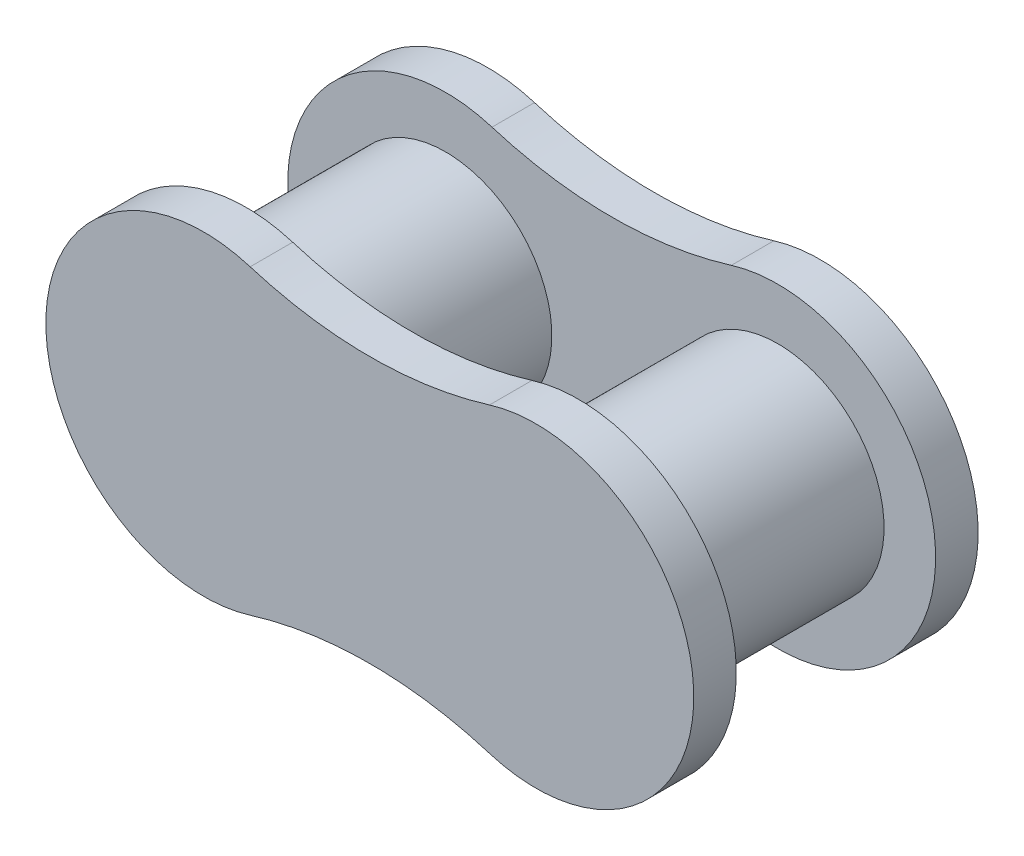
ISO-10303-21;
HEADER;
FILE_DESCRIPTION(('STEP AP214'),'2;1');
FILE_NAME('part.step','',(''),(''),'','','');
FILE_SCHEMA(('AUTOMOTIVE_DESIGN { 1 0 10303 214 1 1 1 1 }'));
ENDSEC;
DATA;
#1=APPLICATION_CONTEXT('core data for automotive mechanical design processes');
#2=APPLICATION_PROTOCOL_DEFINITION('international standard','automotive_design',2000,#1);
#3=PRODUCT_CONTEXT('',#1,'mechanical');
#4=PRODUCT('Part','Part','',(#3));
#5=PRODUCT_RELATED_PRODUCT_CATEGORY('part','',(#4));
#6=PRODUCT_DEFINITION_FORMATION('','',#4);
#7=PRODUCT_DEFINITION_CONTEXT('part definition',#1,'design');
#8=PRODUCT_DEFINITION('design','',#6,#7);
#9=PRODUCT_DEFINITION_SHAPE('','',#8);
#10=(LENGTH_UNIT() NAMED_UNIT(*) SI_UNIT(.MILLI.,.METRE.));
#11=(NAMED_UNIT(*) PLANE_ANGLE_UNIT() SI_UNIT($,.RADIAN.));
#12=(NAMED_UNIT(*) SI_UNIT($,.STERADIAN.) SOLID_ANGLE_UNIT());
#13=UNCERTAINTY_MEASURE_WITH_UNIT(LENGTH_MEASURE(1.E-05),#10,'distance_accuracy_value','');
#14=(GEOMETRIC_REPRESENTATION_CONTEXT(3) GLOBAL_UNCERTAINTY_ASSIGNED_CONTEXT((#13)) GLOBAL_UNIT_ASSIGNED_CONTEXT((#10,
#11,#12)) REPRESENTATION_CONTEXT('',''));
#15=CARTESIAN_POINT('',(0.,0.,0.));
#16=DIRECTION('',(0.,0.,1.));
#17=DIRECTION('',(1.,0.,0.));
#18=AXIS2_PLACEMENT_3D('',#15,#16,#17);
#19=CARTESIAN_POINT('',(0.,25.7910654255321,2.032));
#20=DIRECTION('',(0.,0.,-1.));
#21=DIRECTION('',(-1.,0.,0.));
#22=AXIS2_PLACEMENT_3D('',#19,#20,#21);
#23=CYLINDRICAL_SURFACE('',#22,19.4410654255321);
#24=CARTESIAN_POINT('',(0.,25.7910654255321,0.));
#25=DIRECTION('',(0.,0.,-1.));
#26=DIRECTION('',(1.,0.,0.));
#27=AXIS2_PLACEMENT_3D('',#24,#25,#26);
#28=CIRCLE('',#27,19.4410654255321);
#29=CARTESIAN_POINT('',(5.71851867266143,7.21006520836826,0.));
#30=VERTEX_POINT('',#29);
#31=CARTESIAN_POINT('',(-5.71851867266143,7.21006520836826,0.));
#32=VERTEX_POINT('',#31);
#33=EDGE_CURVE('E162',#30,#32,#28,.T.);
#34=ORIENTED_EDGE('',*,*,#33,.T.);
#35=DIRECTION('',(0.,0.,-1.));
#36=VECTOR('',#35,1.);
#37=CARTESIAN_POINT('',(-5.71851867266143,7.21006520836826,2.032));
#38=LINE('',#37,#36);
#39=CARTESIAN_POINT('',(-5.71851867266143,7.21006520836826,2.032));
#40=VERTEX_POINT('',#39);
#41=EDGE_CURVE('E11',#40,#32,#38,.T.);
#42=ORIENTED_EDGE('',*,*,#41,.F.);
#43=CARTESIAN_POINT('',(0.,25.7910654255321,2.032));
#44=DIRECTION('',(0.,0.,-1.));
#45=DIRECTION('',(1.,0.,0.));
#46=AXIS2_PLACEMENT_3D('',#43,#44,#45);
#47=CIRCLE('',#46,19.4410654255321);
#48=CARTESIAN_POINT('',(5.71851867266143,7.21006520836826,2.032));
#49=VERTEX_POINT('',#48);
#50=EDGE_CURVE('E165',#49,#40,#47,.T.);
#51=ORIENTED_EDGE('',*,*,#50,.F.);
#52=DIRECTION('',(0.,0.,-1.));
#53=VECTOR('',#52,1.);
#54=CARTESIAN_POINT('',(5.71851867266143,7.21006520836826,2.032));
#55=LINE('',#54,#53);
#56=EDGE_CURVE('E171',#49,#30,#55,.T.);
#57=ORIENTED_EDGE('',*,*,#56,.T.);
#58=EDGE_LOOP('',(#34,#42,#51,#57));
#59=FACE_BOUND('',#58,.T.);
#60=ADVANCED_FACE('F36',(#59),#23,.F.);
#61=CARTESIAN_POINT('',(-7.9375,0.,2.032));
#62=DIRECTION('',(0.,0.,-1.));
#63=DIRECTION('',(-1.,0.,0.));
#64=AXIS2_PLACEMENT_3D('',#61,#62,#63);
#65=CYLINDRICAL_SURFACE('',#64,7.54379999999999);
#66=CARTESIAN_POINT('',(-7.9375,0.,0.));
#67=DIRECTION('',(0.,0.,1.));
#68=DIRECTION('',(1.,0.,0.));
#69=AXIS2_PLACEMENT_3D('',#66,#67,#68);
#70=CIRCLE('',#69,7.54379999999999);
#71=CARTESIAN_POINT('',(-5.71851867266142,-7.21006520836828,0.));
#72=VERTEX_POINT('',#71);
#73=EDGE_CURVE('E174',#32,#72,#70,.T.);
#74=ORIENTED_EDGE('',*,*,#73,.T.);
#75=DIRECTION('',(0.,0.,-1.));
#76=VECTOR('',#75,1.);
#77=CARTESIAN_POINT('',(-5.71851867266142,-7.21006520836828,2.032));
#78=LINE('',#77,#76);
#79=CARTESIAN_POINT('',(-5.71851867266142,-7.21006520836828,2.032));
#80=VERTEX_POINT('',#79);
#81=EDGE_CURVE('E44',#80,#72,#78,.T.);
#82=ORIENTED_EDGE('',*,*,#81,.F.);
#83=CARTESIAN_POINT('',(-7.9375,0.,2.032));
#84=DIRECTION('',(0.,0.,1.));
#85=DIRECTION('',(1.,0.,0.));
#86=AXIS2_PLACEMENT_3D('',#83,#84,#85);
#87=CIRCLE('',#86,7.54379999999999);
#88=EDGE_CURVE('E83',#40,#80,#87,.T.);
#89=ORIENTED_EDGE('',*,*,#88,.F.);
#90=ORIENTED_EDGE('',*,*,#41,.T.);
#91=EDGE_LOOP('',(#74,#82,#89,#90));
#92=FACE_BOUND('',#91,.T.);
#93=ADVANCED_FACE('F198',(#92),#65,.T.);
#94=CARTESIAN_POINT('',(0.,-25.7910654255321,2.032));
#95=DIRECTION('',(0.,0.,-1.));
#96=DIRECTION('',(-1.,0.,0.));
#97=AXIS2_PLACEMENT_3D('',#94,#95,#96);
#98=CYLINDRICAL_SURFACE('',#97,19.4410654255321);
#99=CARTESIAN_POINT('',(0.,-25.7910654255321,0.));
#100=DIRECTION('',(0.,0.,-1.));
#101=DIRECTION('',(-1.,0.,0.));
#102=AXIS2_PLACEMENT_3D('',#99,#100,#101);
#103=CIRCLE('',#102,19.4410654255321);
#104=CARTESIAN_POINT('',(5.71851867266143,-7.21006520836827,0.));
#105=VERTEX_POINT('',#104);
#106=EDGE_CURVE('E70',#72,#105,#103,.T.);
#107=ORIENTED_EDGE('',*,*,#106,.T.);
#108=DIRECTION('',(0.,0.,-1.));
#109=VECTOR('',#108,1.);
#110=CARTESIAN_POINT('',(5.71851867266143,-7.21006520836827,2.032));
#111=LINE('',#110,#109);
#112=CARTESIAN_POINT('',(5.71851867266143,-7.21006520836827,2.032));
#113=VERTEX_POINT('',#112);
#114=EDGE_CURVE('E179',#113,#105,#111,.T.);
#115=ORIENTED_EDGE('',*,*,#114,.F.);
#116=CARTESIAN_POINT('',(0.,-25.7910654255321,2.032));
#117=DIRECTION('',(0.,0.,-1.));
#118=DIRECTION('',(-1.,0.,0.));
#119=AXIS2_PLACEMENT_3D('',#116,#117,#118);
#120=CIRCLE('',#119,19.4410654255321);
#121=EDGE_CURVE('E168',#80,#113,#120,.T.);
#122=ORIENTED_EDGE('',*,*,#121,.F.);
#123=ORIENTED_EDGE('',*,*,#81,.T.);
#124=EDGE_LOOP('',(#107,#115,#122,#123));
#125=FACE_BOUND('',#124,.T.);
#126=ADVANCED_FACE('F181',(#125),#98,.F.);
#127=CARTESIAN_POINT('',(7.9375,0.,2.032));
#128=DIRECTION('',(0.,0.,-1.));
#129=DIRECTION('',(-1.,0.,0.));
#130=AXIS2_PLACEMENT_3D('',#127,#128,#129);
#131=CYLINDRICAL_SURFACE('',#130,7.54379999999999);
#132=CARTESIAN_POINT('',(7.9375,0.,0.));
#133=DIRECTION('',(0.,0.,1.));
#134=DIRECTION('',(-1.,0.,0.));
#135=AXIS2_PLACEMENT_3D('',#132,#133,#134);
#136=CIRCLE('',#135,7.54379999999999);
#137=EDGE_CURVE('E76',#105,#30,#136,.T.);
#138=ORIENTED_EDGE('',*,*,#137,.T.);
#139=ORIENTED_EDGE('',*,*,#56,.F.);
#140=CARTESIAN_POINT('',(7.9375,0.,2.032));
#141=DIRECTION('',(0.,0.,1.));
#142=DIRECTION('',(-1.,0.,0.));
#143=AXIS2_PLACEMENT_3D('',#140,#141,#142);
#144=CIRCLE('',#143,7.54379999999999);
#145=EDGE_CURVE('E52',#113,#49,#144,.T.);
#146=ORIENTED_EDGE('',*,*,#145,.F.);
#147=ORIENTED_EDGE('',*,*,#114,.T.);
#148=EDGE_LOOP('',(#138,#139,#146,#147));
#149=FACE_BOUND('',#148,.T.);
#150=ADVANCED_FACE('F188',(#149),#131,.T.);
#151=CARTESIAN_POINT('',(3.96875,12.895532712766,2.032));
#152=DIRECTION('',(0.,0.,1.));
#153=DIRECTION('',(1.,0.,0.));
#154=AXIS2_PLACEMENT_3D('',#151,#152,#153);
#155=PLANE('',#154);
#156=CARTESIAN_POINT('',(7.9375,0.,2.032));
#157=DIRECTION('',(0.,0.,1.));
#158=DIRECTION('',(-1.,0.,0.));
#159=AXIS2_PLACEMENT_3D('',#156,#157,#158);
#160=CIRCLE('',#159,5.08);
#161=CARTESIAN_POINT('',(2.8575,0.,2.032));
#162=VERTEX_POINT('',#161);
#163=EDGE_CURVE('E121',#162,#162,#160,.T.);
#164=ORIENTED_EDGE('',*,*,#163,.F.);
#165=EDGE_LOOP('',(#164));
#166=FACE_BOUND('',#165,.T.);
#167=CARTESIAN_POINT('',(-7.9375,0.,2.032));
#168=DIRECTION('',(0.,0.,1.));
#169=DIRECTION('',(1.,0.,0.));
#170=AXIS2_PLACEMENT_3D('',#167,#168,#169);
#171=CIRCLE('',#170,5.08);
#172=CARTESIAN_POINT('',(-13.0175,0.,2.032));
#173=VERTEX_POINT('',#172);
#174=EDGE_CURVE('E156',#173,#173,#171,.T.);
#175=ORIENTED_EDGE('',*,*,#174,.F.);
#176=EDGE_LOOP('',(#175));
#177=FACE_BOUND('',#176,.T.);
#178=ORIENTED_EDGE('',*,*,#50,.T.);
#179=ORIENTED_EDGE('',*,*,#88,.T.);
#180=ORIENTED_EDGE('',*,*,#121,.T.);
#181=ORIENTED_EDGE('',*,*,#145,.T.);
#182=EDGE_LOOP('',(#178,#179,#180,#181));
#183=FACE_BOUND('',#182,.T.);
#184=ADVANCED_FACE('F190',(#166,#177,#183),#155,.T.);
#185=CARTESIAN_POINT('',(3.96875,12.895532712766,0.));
#186=DIRECTION('',(0.,0.,1.));
#187=DIRECTION('',(1.,0.,0.));
#188=AXIS2_PLACEMENT_3D('',#185,#186,#187);
#189=PLANE('',#188);
#190=ORIENTED_EDGE('',*,*,#33,.F.);
#191=ORIENTED_EDGE('',*,*,#137,.F.);
#192=ORIENTED_EDGE('',*,*,#106,.F.);
#193=ORIENTED_EDGE('',*,*,#73,.F.);
#194=EDGE_LOOP('',(#190,#191,#192,#193));
#195=FACE_BOUND('',#194,.T.);
#196=ADVANCED_FACE('F184',(#195),#189,.F.);
#197=CARTESIAN_POINT('',(-7.9375,0.,11.557));
#198=DIRECTION('',(0.,0.,-1.));
#199=DIRECTION('',(-1.,0.,0.));
#200=AXIS2_PLACEMENT_3D('',#197,#198,#199);
#201=CYLINDRICAL_SURFACE('',#200,5.08);
#202=CARTESIAN_POINT('',(-7.9375,0.,11.557));
#203=DIRECTION('',(0.,0.,1.));
#204=DIRECTION('',(1.,0.,0.));
#205=AXIS2_PLACEMENT_3D('',#202,#203,#204);
#206=CIRCLE('',#205,5.08);
#207=CARTESIAN_POINT('',(-13.0175,0.,11.557));
#208=VERTEX_POINT('',#207);
#209=EDGE_CURVE('E159',#208,#208,#206,.T.);
#210=CARTESIAN_POINT('',(-13.0175,0.,11.557));
#211=CARTESIAN_POINT('',(-13.0175,0.,11.45778125));
#212=CARTESIAN_POINT('',(-13.0175,0.,11.3585625));
#213=CARTESIAN_POINT('',(-13.0175,0.,11.160125));
#214=CARTESIAN_POINT('',(-13.0175,0.,11.06090625));
#215=CARTESIAN_POINT('',(-13.0175,0.,10.86246875));
#216=CARTESIAN_POINT('',(-13.0175,0.,10.76325));
#217=CARTESIAN_POINT('',(-13.0175,0.,10.5648125));
#218=CARTESIAN_POINT('',(-13.0175,0.,10.46559375));
#219=CARTESIAN_POINT('',(-13.0175,0.,10.26715625));
#220=CARTESIAN_POINT('',(-13.0175,0.,10.1679375));
#221=CARTESIAN_POINT('',(-13.0175,0.,9.9695));
#222=CARTESIAN_POINT('',(-13.0175,0.,9.87028125));
#223=CARTESIAN_POINT('',(-13.0175,0.,9.67184375));
#224=CARTESIAN_POINT('',(-13.0175,0.,9.572625));
#225=CARTESIAN_POINT('',(-13.0175,0.,9.3741875));
#226=CARTESIAN_POINT('',(-13.0175,0.,9.27496875));
#227=CARTESIAN_POINT('',(-13.0175,0.,9.07653125));
#228=CARTESIAN_POINT('',(-13.0175,0.,8.9773125));
#229=CARTESIAN_POINT('',(-13.0175,0.,8.778875));
#230=CARTESIAN_POINT('',(-13.0175,0.,8.67965625));
#231=CARTESIAN_POINT('',(-13.0175,0.,8.48121875));
#232=CARTESIAN_POINT('',(-13.0175,0.,8.382));
#233=CARTESIAN_POINT('',(-13.0175,0.,8.1835625));
#234=CARTESIAN_POINT('',(-13.0175,0.,8.08434375));
#235=CARTESIAN_POINT('',(-13.0175,0.,7.88590625));
#236=CARTESIAN_POINT('',(-13.0175,0.,7.7866875));
#237=CARTESIAN_POINT('',(-13.0175,0.,7.58825));
#238=CARTESIAN_POINT('',(-13.0175,0.,7.48903125));
#239=CARTESIAN_POINT('',(-13.0175,0.,7.29059375));
#240=CARTESIAN_POINT('',(-13.0175,0.,7.191375));
#241=CARTESIAN_POINT('',(-13.0175,0.,6.9929375));
#242=CARTESIAN_POINT('',(-13.0175,0.,6.89371875));
#243=CARTESIAN_POINT('',(-13.0175,0.,6.69528125));
#244=CARTESIAN_POINT('',(-13.0175,0.,6.5960625));
#245=CARTESIAN_POINT('',(-13.0175,0.,6.397625));
#246=CARTESIAN_POINT('',(-13.0175,0.,6.29840625));
#247=CARTESIAN_POINT('',(-13.0175,0.,6.09996875));
#248=CARTESIAN_POINT('',(-13.0175,0.,6.00075));
#249=CARTESIAN_POINT('',(-13.0175,0.,5.8023125));
#250=CARTESIAN_POINT('',(-13.0175,0.,5.70309375));
#251=CARTESIAN_POINT('',(-13.0175,0.,5.50465625));
#252=CARTESIAN_POINT('',(-13.0175,0.,5.4054375));
#253=CARTESIAN_POINT('',(-13.0175,0.,5.207));
#254=CARTESIAN_POINT('',(-13.0175,0.,5.10778125));
#255=CARTESIAN_POINT('',(-13.0175,0.,4.90934375));
#256=CARTESIAN_POINT('',(-13.0175,0.,4.810125));
#257=CARTESIAN_POINT('',(-13.0175,0.,4.6116875));
#258=CARTESIAN_POINT('',(-13.0175,0.,4.51246875));
#259=CARTESIAN_POINT('',(-13.0175,0.,4.31403125));
#260=CARTESIAN_POINT('',(-13.0175,0.,4.2148125));
#261=CARTESIAN_POINT('',(-13.0175,0.,4.016375));
#262=CARTESIAN_POINT('',(-13.0175,0.,3.91715625));
#263=CARTESIAN_POINT('',(-13.0175,0.,3.71871875));
#264=CARTESIAN_POINT('',(-13.0175,0.,3.6195));
#265=CARTESIAN_POINT('',(-13.0175,0.,3.4210625));
#266=CARTESIAN_POINT('',(-13.0175,0.,3.32184375));
#267=CARTESIAN_POINT('',(-13.0175,0.,3.12340625));
#268=CARTESIAN_POINT('',(-13.0175,0.,3.0241875));
#269=CARTESIAN_POINT('',(-13.0175,0.,2.82575));
#270=CARTESIAN_POINT('',(-13.0175,0.,2.72653125));
#271=CARTESIAN_POINT('',(-13.0175,0.,2.52809375));
#272=CARTESIAN_POINT('',(-13.0175,0.,2.428875));
#273=CARTESIAN_POINT('',(-13.0175,0.,2.2304375));
#274=CARTESIAN_POINT('',(-13.0175,0.,2.13121875));
#275=CARTESIAN_POINT('',(-13.0175,0.,2.032));
#276=B_SPLINE_CURVE_WITH_KNOTS('',3,(#210,#211,#212,#213,#214,#215,#216,#217,#218,#219,#220,
#221,#222,#223,#224,#225,#226,#227,#228,#229,#230,#231,#232,#233,#234,#235,#236,#237,#238,#239,
#240,#241,#242,#243,#244,#245,#246,#247,#248,#249,#250,#251,#252,#253,#254,#255,#256,#257,#258,
#259,#260,#261,#262,#263,#264,#265,#266,#267,#268,#269,#270,#271,#272,#273,#274,#275),
.UNSPECIFIED.,.F.,.F.,(4,2,2,2,2,2,2,2,2,2,2,2,2,2,2,2,2,2,2,2,2,2,2,2,2,2,2,2,2,2,2,2,4),(0.,
0.29765625,0.5953125,0.892968750000001,1.190625,1.48828125,1.7859375,2.08359375,2.38125,
2.67890625,2.9765625,3.27421875,3.571875,3.86953125,4.1671875,4.46484375,4.7625,5.06015625,
5.3578125,5.65546875,5.953125,6.25078125,6.5484375,6.84609375,7.14375,7.44140625,7.7390625,
8.03671875,8.334375,8.63203125,8.9296875,9.22734375,9.525),.UNSPECIFIED.);
#277=EDGE_CURVE('BSEAM225',#208,#173,#276,.T.);
#278=ORIENTED_EDGE('',*,*,#209,.F.);
#279=ORIENTED_EDGE('',*,*,#174,.T.);
#280=ORIENTED_EDGE('',*,*,#277,.T.);
#281=ORIENTED_EDGE('',*,*,#277,.F.);
#282=EDGE_LOOP('',(#278,#280,#279,#281));
#283=FACE_BOUND('',#282,.T.);
#284=ADVANCED_FACE('F225',(#283),#201,.T.);
#285=CARTESIAN_POINT('',(7.9375,0.,11.557));
#286=DIRECTION('',(0.,0.,-1.));
#287=DIRECTION('',(-1.,0.,0.));
#288=AXIS2_PLACEMENT_3D('',#285,#286,#287);
#289=CYLINDRICAL_SURFACE('',#288,5.08);
#290=CARTESIAN_POINT('',(7.9375,0.,11.557));
#291=DIRECTION('',(0.,0.,1.));
#292=DIRECTION('',(-1.,0.,0.));
#293=AXIS2_PLACEMENT_3D('',#290,#291,#292);
#294=CIRCLE('',#293,5.08);
#295=CARTESIAN_POINT('',(2.8575,0.,11.557));
#296=VERTEX_POINT('',#295);
#297=EDGE_CURVE('E153',#296,#296,#294,.T.);
#298=CARTESIAN_POINT('',(2.8575,0.,11.557));
#299=CARTESIAN_POINT('',(2.8575,0.,11.45778125));
#300=CARTESIAN_POINT('',(2.8575,0.,11.3585625));
#301=CARTESIAN_POINT('',(2.8575,0.,11.160125));
#302=CARTESIAN_POINT('',(2.8575,0.,11.06090625));
#303=CARTESIAN_POINT('',(2.8575,0.,10.86246875));
#304=CARTESIAN_POINT('',(2.8575,0.,10.76325));
#305=CARTESIAN_POINT('',(2.8575,0.,10.5648125));
#306=CARTESIAN_POINT('',(2.8575,0.,10.46559375));
#307=CARTESIAN_POINT('',(2.8575,0.,10.26715625));
#308=CARTESIAN_POINT('',(2.8575,0.,10.1679375));
#309=CARTESIAN_POINT('',(2.8575,0.,9.9695));
#310=CARTESIAN_POINT('',(2.8575,0.,9.87028125));
#311=CARTESIAN_POINT('',(2.8575,0.,9.67184375));
#312=CARTESIAN_POINT('',(2.8575,0.,9.572625));
#313=CARTESIAN_POINT('',(2.8575,0.,9.3741875));
#314=CARTESIAN_POINT('',(2.8575,0.,9.27496875));
#315=CARTESIAN_POINT('',(2.8575,0.,9.07653125));
#316=CARTESIAN_POINT('',(2.8575,0.,8.9773125));
#317=CARTESIAN_POINT('',(2.8575,0.,8.778875));
#318=CARTESIAN_POINT('',(2.8575,0.,8.67965625));
#319=CARTESIAN_POINT('',(2.8575,0.,8.48121875));
#320=CARTESIAN_POINT('',(2.8575,0.,8.382));
#321=CARTESIAN_POINT('',(2.8575,0.,8.1835625));
#322=CARTESIAN_POINT('',(2.8575,0.,8.08434375));
#323=CARTESIAN_POINT('',(2.8575,0.,7.88590625));
#324=CARTESIAN_POINT('',(2.8575,0.,7.7866875));
#325=CARTESIAN_POINT('',(2.8575,0.,7.58825));
#326=CARTESIAN_POINT('',(2.8575,0.,7.48903125));
#327=CARTESIAN_POINT('',(2.8575,0.,7.29059375));
#328=CARTESIAN_POINT('',(2.8575,0.,7.191375));
#329=CARTESIAN_POINT('',(2.8575,0.,6.9929375));
#330=CARTESIAN_POINT('',(2.8575,0.,6.89371875));
#331=CARTESIAN_POINT('',(2.8575,0.,6.69528125));
#332=CARTESIAN_POINT('',(2.8575,0.,6.5960625));
#333=CARTESIAN_POINT('',(2.8575,0.,6.397625));
#334=CARTESIAN_POINT('',(2.8575,0.,6.29840625));
#335=CARTESIAN_POINT('',(2.8575,0.,6.09996875));
#336=CARTESIAN_POINT('',(2.8575,0.,6.00075));
#337=CARTESIAN_POINT('',(2.8575,0.,5.8023125));
#338=CARTESIAN_POINT('',(2.8575,0.,5.70309375));
#339=CARTESIAN_POINT('',(2.8575,0.,5.50465625));
#340=CARTESIAN_POINT('',(2.8575,0.,5.4054375));
#341=CARTESIAN_POINT('',(2.8575,0.,5.207));
#342=CARTESIAN_POINT('',(2.8575,0.,5.10778125));
#343=CARTESIAN_POINT('',(2.8575,0.,4.90934375));
#344=CARTESIAN_POINT('',(2.8575,0.,4.810125));
#345=CARTESIAN_POINT('',(2.8575,0.,4.6116875));
#346=CARTESIAN_POINT('',(2.8575,0.,4.51246875));
#347=CARTESIAN_POINT('',(2.8575,0.,4.31403125));
#348=CARTESIAN_POINT('',(2.8575,0.,4.2148125));
#349=CARTESIAN_POINT('',(2.8575,0.,4.016375));
#350=CARTESIAN_POINT('',(2.8575,0.,3.91715625));
#351=CARTESIAN_POINT('',(2.8575,0.,3.71871875));
#352=CARTESIAN_POINT('',(2.8575,0.,3.6195));
#353=CARTESIAN_POINT('',(2.8575,0.,3.4210625));
#354=CARTESIAN_POINT('',(2.8575,0.,3.32184375));
#355=CARTESIAN_POINT('',(2.8575,0.,3.12340625));
#356=CARTESIAN_POINT('',(2.8575,0.,3.0241875));
#357=CARTESIAN_POINT('',(2.8575,0.,2.82575));
#358=CARTESIAN_POINT('',(2.8575,0.,2.72653125));
#359=CARTESIAN_POINT('',(2.8575,0.,2.52809375));
#360=CARTESIAN_POINT('',(2.8575,0.,2.428875));
#361=CARTESIAN_POINT('',(2.8575,0.,2.2304375));
#362=CARTESIAN_POINT('',(2.8575,0.,2.13121875));
#363=CARTESIAN_POINT('',(2.8575,0.,2.032));
#364=B_SPLINE_CURVE_WITH_KNOTS('',3,(#298,#299,#300,#301,#302,#303,#304,#305,#306,#307,#308,
#309,#310,#311,#312,#313,#314,#315,#316,#317,#318,#319,#320,#321,#322,#323,#324,#325,#326,#327,
#328,#329,#330,#331,#332,#333,#334,#335,#336,#337,#338,#339,#340,#341,#342,#343,#344,#345,#346,
#347,#348,#349,#350,#351,#352,#353,#354,#355,#356,#357,#358,#359,#360,#361,#362,#363),
.UNSPECIFIED.,.F.,.F.,(4,2,2,2,2,2,2,2,2,2,2,2,2,2,2,2,2,2,2,2,2,2,2,2,2,2,2,2,2,2,2,2,4),(0.,
0.29765625,0.5953125,0.892968750000001,1.190625,1.48828125,1.7859375,2.08359375,2.38125,
2.67890625,2.9765625,3.27421875,3.571875,3.86953125,4.1671875,4.46484375,4.7625,5.06015625,
5.3578125,5.65546875,5.953125,6.25078125,6.5484375,6.84609375,7.14375,7.44140625,7.7390625,
8.03671875,8.334375,8.63203125,8.9296875,9.22734375,9.525),.UNSPECIFIED.);
#365=EDGE_CURVE('BSEAM238',#296,#162,#364,.T.);
#366=ORIENTED_EDGE('',*,*,#297,.F.);
#367=ORIENTED_EDGE('',*,*,#163,.T.);
#368=ORIENTED_EDGE('',*,*,#365,.T.);
#369=ORIENTED_EDGE('',*,*,#365,.F.);
#370=EDGE_LOOP('',(#366,#368,#367,#369));
#371=FACE_BOUND('',#370,.T.);
#372=ADVANCED_FACE('F238',(#371),#289,.T.);
#373=CARTESIAN_POINT('',(0.,25.7910654255321,11.557));
#374=DIRECTION('',(0.,0.,1.));
#375=DIRECTION('',(1.,0.,0.));
#376=AXIS2_PLACEMENT_3D('',#373,#374,#375);
#377=CYLINDRICAL_SURFACE('',#376,19.4410654255321);
#378=CARTESIAN_POINT('',(0.,25.7910654255321,13.589));
#379=DIRECTION('',(0.,0.,-1.));
#380=DIRECTION('',(1.,0.,0.));
#381=AXIS2_PLACEMENT_3D('',#378,#379,#380);
#382=CIRCLE('',#381,19.4410654255321);
#383=CARTESIAN_POINT('',(5.71851867266143,7.21006520836826,13.589));
#384=VERTEX_POINT('',#383);
#385=CARTESIAN_POINT('',(-5.71851867266143,7.21006520836826,13.589));
#386=VERTEX_POINT('',#385);
#387=EDGE_CURVE('E116',#384,#386,#382,.T.);
#388=ORIENTED_EDGE('',*,*,#387,.F.);
#389=DIRECTION('',(0.,0.,1.));
#390=VECTOR('',#389,1.);
#391=CARTESIAN_POINT('',(5.71851867266143,7.21006520836826,11.557));
#392=LINE('',#391,#390);
#393=CARTESIAN_POINT('',(5.71851867266143,7.21006520836826,11.557));
#394=VERTEX_POINT('',#393);
#395=EDGE_CURVE('E110',#394,#384,#392,.T.);
#396=ORIENTED_EDGE('',*,*,#395,.F.);
#397=CARTESIAN_POINT('',(0.,25.7910654255321,11.557));
#398=DIRECTION('',(0.,0.,-1.));
#399=DIRECTION('',(1.,0.,0.));
#400=AXIS2_PLACEMENT_3D('',#397,#398,#399);
#401=CIRCLE('',#400,19.4410654255321);
#402=CARTESIAN_POINT('',(-5.71851867266143,7.21006520836826,11.557));
#403=VERTEX_POINT('',#402);
#404=EDGE_CURVE('E113',#394,#403,#401,.T.);
#405=ORIENTED_EDGE('',*,*,#404,.T.);
#406=DIRECTION('',(0.,0.,1.));
#407=VECTOR('',#406,1.);
#408=CARTESIAN_POINT('',(-5.71851867266143,7.21006520836826,11.557));
#409=LINE('',#408,#407);
#410=EDGE_CURVE('E140',#403,#386,#409,.T.);
#411=ORIENTED_EDGE('',*,*,#410,.T.);
#412=EDGE_LOOP('',(#388,#396,#405,#411));
#413=FACE_BOUND('',#412,.T.);
#414=ADVANCED_FACE('F112',(#413),#377,.F.);
#415=CARTESIAN_POINT('',(7.9375,0.,11.557));
#416=DIRECTION('',(0.,0.,1.));
#417=DIRECTION('',(1.,0.,0.));
#418=AXIS2_PLACEMENT_3D('',#415,#416,#417);
#419=CYLINDRICAL_SURFACE('',#418,7.54379999999999);
#420=CARTESIAN_POINT('',(7.9375,0.,13.589));
#421=DIRECTION('',(0.,0.,1.));
#422=DIRECTION('',(-1.,0.,0.));
#423=AXIS2_PLACEMENT_3D('',#420,#421,#422);
#424=CIRCLE('',#423,7.54379999999999);
#425=CARTESIAN_POINT('',(5.71851867266143,-7.21006520836827,13.589));
#426=VERTEX_POINT('',#425);
#427=EDGE_CURVE('E142',#426,#384,#424,.T.);
#428=ORIENTED_EDGE('',*,*,#427,.F.);
#429=DIRECTION('',(0.,0.,1.));
#430=VECTOR('',#429,1.);
#431=CARTESIAN_POINT('',(5.71851867266143,-7.21006520836827,11.557));
#432=LINE('',#431,#430);
#433=CARTESIAN_POINT('',(5.71851867266143,-7.21006520836827,11.557));
#434=VERTEX_POINT('',#433);
#435=EDGE_CURVE('E122',#434,#426,#432,.T.);
#436=ORIENTED_EDGE('',*,*,#435,.F.);
#437=CARTESIAN_POINT('',(7.9375,0.,11.557));
#438=DIRECTION('',(0.,0.,1.));
#439=DIRECTION('',(-1.,0.,0.));
#440=AXIS2_PLACEMENT_3D('',#437,#438,#439);
#441=CIRCLE('',#440,7.54379999999999);
#442=EDGE_CURVE('E128',#434,#394,#441,.T.);
#443=ORIENTED_EDGE('',*,*,#442,.T.);
#444=ORIENTED_EDGE('',*,*,#395,.T.);
#445=EDGE_LOOP('',(#428,#436,#443,#444));
#446=FACE_BOUND('',#445,.T.);
#447=ADVANCED_FACE('F134',(#446),#419,.T.);
#448=CARTESIAN_POINT('',(0.,-25.7910654255321,11.557));
#449=DIRECTION('',(0.,0.,1.));
#450=DIRECTION('',(1.,0.,0.));
#451=AXIS2_PLACEMENT_3D('',#448,#449,#450);
#452=CYLINDRICAL_SURFACE('',#451,19.4410654255321);
#453=CARTESIAN_POINT('',(0.,-25.7910654255321,13.589));
#454=DIRECTION('',(0.,0.,-1.));
#455=DIRECTION('',(-1.,0.,0.));
#456=AXIS2_PLACEMENT_3D('',#453,#454,#455);
#457=CIRCLE('',#456,19.4410654255321);
#458=CARTESIAN_POINT('',(-5.71851867266142,-7.21006520836828,13.589));
#459=VERTEX_POINT('',#458);
#460=EDGE_CURVE('E144',#459,#426,#457,.T.);
#461=ORIENTED_EDGE('',*,*,#460,.F.);
#462=DIRECTION('',(0.,0.,1.));
#463=VECTOR('',#462,1.);
#464=CARTESIAN_POINT('',(-5.71851867266142,-7.21006520836828,11.557));
#465=LINE('',#464,#463);
#466=CARTESIAN_POINT('',(-5.71851867266142,-7.21006520836828,11.557));
#467=VERTEX_POINT('',#466);
#468=EDGE_CURVE('E150',#467,#459,#465,.T.);
#469=ORIENTED_EDGE('',*,*,#468,.F.);
#470=CARTESIAN_POINT('',(0.,-25.7910654255321,11.557));
#471=DIRECTION('',(0.,0.,-1.));
#472=DIRECTION('',(-1.,0.,0.));
#473=AXIS2_PLACEMENT_3D('',#470,#471,#472);
#474=CIRCLE('',#473,19.4410654255321);
#475=EDGE_CURVE('E135',#467,#434,#474,.T.);
#476=ORIENTED_EDGE('',*,*,#475,.T.);
#477=ORIENTED_EDGE('',*,*,#435,.T.);
#478=EDGE_LOOP('',(#461,#469,#476,#477));
#479=FACE_BOUND('',#478,.T.);
#480=ADVANCED_FACE('F265',(#479),#452,.F.);
#481=CARTESIAN_POINT('',(-7.9375,0.,11.557));
#482=DIRECTION('',(0.,0.,1.));
#483=DIRECTION('',(1.,0.,0.));
#484=AXIS2_PLACEMENT_3D('',#481,#482,#483);
#485=CYLINDRICAL_SURFACE('',#484,7.54379999999999);
#486=CARTESIAN_POINT('',(-7.9375,0.,13.589));
#487=DIRECTION('',(0.,0.,1.));
#488=DIRECTION('',(1.,0.,0.));
#489=AXIS2_PLACEMENT_3D('',#486,#487,#488);
#490=CIRCLE('',#489,7.54379999999999);
#491=EDGE_CURVE('E132',#386,#459,#490,.T.);
#492=ORIENTED_EDGE('',*,*,#491,.F.);
#493=ORIENTED_EDGE('',*,*,#410,.F.);
#494=CARTESIAN_POINT('',(-7.9375,0.,11.557));
#495=DIRECTION('',(0.,0.,1.));
#496=DIRECTION('',(1.,0.,0.));
#497=AXIS2_PLACEMENT_3D('',#494,#495,#496);
#498=CIRCLE('',#497,7.54379999999999);
#499=EDGE_CURVE('E131',#403,#467,#498,.T.);
#500=ORIENTED_EDGE('',*,*,#499,.T.);
#501=ORIENTED_EDGE('',*,*,#468,.T.);
#502=EDGE_LOOP('',(#492,#493,#500,#501));
#503=FACE_BOUND('',#502,.T.);
#504=ADVANCED_FACE('F274',(#503),#485,.T.);
#505=CARTESIAN_POINT('',(3.96875,12.895532712766,11.557));
#506=DIRECTION('',(0.,0.,-1.));
#507=DIRECTION('',(1.,0.,0.));
#508=AXIS2_PLACEMENT_3D('',#505,#506,#507);
#509=PLANE('',#508);
#510=ORIENTED_EDGE('',*,*,#209,.T.);
#511=EDGE_LOOP('',(#510));
#512=FACE_BOUND('',#511,.T.);
#513=ORIENTED_EDGE('',*,*,#297,.T.);
#514=EDGE_LOOP('',(#513));
#515=FACE_BOUND('',#514,.T.);
#516=ORIENTED_EDGE('',*,*,#404,.F.);
#517=ORIENTED_EDGE('',*,*,#442,.F.);
#518=ORIENTED_EDGE('',*,*,#475,.F.);
#519=ORIENTED_EDGE('',*,*,#499,.F.);
#520=EDGE_LOOP('',(#516,#517,#518,#519));
#521=FACE_BOUND('',#520,.T.);
#522=ADVANCED_FACE('F126',(#512,#515,#521),#509,.T.);
#523=CARTESIAN_POINT('',(3.96875,12.895532712766,13.589));
#524=DIRECTION('',(0.,0.,-1.));
#525=DIRECTION('',(1.,0.,0.));
#526=AXIS2_PLACEMENT_3D('',#523,#524,#525);
#527=PLANE('',#526);
#528=ORIENTED_EDGE('',*,*,#387,.T.);
#529=ORIENTED_EDGE('',*,*,#491,.T.);
#530=ORIENTED_EDGE('',*,*,#460,.T.);
#531=ORIENTED_EDGE('',*,*,#427,.T.);
#532=EDGE_LOOP('',(#528,#529,#530,#531));
#533=FACE_BOUND('',#532,.T.);
#534=ADVANCED_FACE('F293',(#533),#527,.F.);
#535=CLOSED_SHELL('',(#60,#93,#126,#150,#184,#196,#284,#372,#414,#447,#480,#504,#522,#534));
#536=MANIFOLD_SOLID_BREP('B2',#535);
#537=ADVANCED_BREP_SHAPE_REPRESENTATION('',(#18,#536),#14);
#538=SHAPE_DEFINITION_REPRESENTATION(#9,#537);
ENDSEC;
END-ISO-10303-21;
